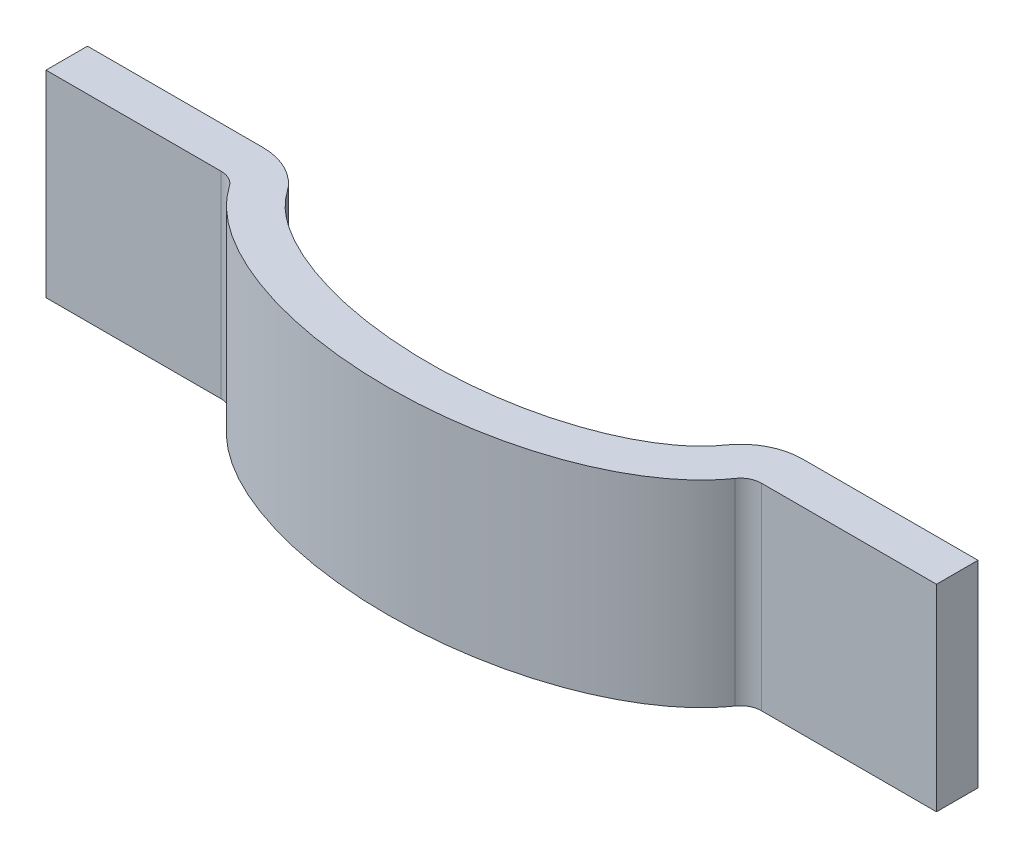
ISO-10303-21;
HEADER;
FILE_DESCRIPTION(('STEP AP214'),'2;1');
FILE_NAME('part.step','',(''),(''),'','','');
FILE_SCHEMA(('AUTOMOTIVE_DESIGN { 1 0 10303 214 1 1 1 1 }'));
ENDSEC;
DATA;
#1=APPLICATION_CONTEXT('core data for automotive mechanical design processes');
#2=APPLICATION_PROTOCOL_DEFINITION('international standard','automotive_design',2000,#1);
#3=PRODUCT_CONTEXT('',#1,'mechanical');
#4=PRODUCT('Part','Part','',(#3));
#5=PRODUCT_RELATED_PRODUCT_CATEGORY('part','',(#4));
#6=PRODUCT_DEFINITION_FORMATION('','',#4);
#7=PRODUCT_DEFINITION_CONTEXT('part definition',#1,'design');
#8=PRODUCT_DEFINITION('design','',#6,#7);
#9=PRODUCT_DEFINITION_SHAPE('','',#8);
#10=(LENGTH_UNIT() NAMED_UNIT(*) SI_UNIT(.MILLI.,.METRE.));
#11=(NAMED_UNIT(*) PLANE_ANGLE_UNIT() SI_UNIT($,.RADIAN.));
#12=(NAMED_UNIT(*) SI_UNIT($,.STERADIAN.) SOLID_ANGLE_UNIT());
#13=UNCERTAINTY_MEASURE_WITH_UNIT(LENGTH_MEASURE(1.E-05),#10,'distance_accuracy_value','');
#14=(GEOMETRIC_REPRESENTATION_CONTEXT(3) GLOBAL_UNCERTAINTY_ASSIGNED_CONTEXT((#13)) GLOBAL_UNIT_ASSIGNED_CONTEXT((#10,
#11,#12)) REPRESENTATION_CONTEXT('',''));
#15=CARTESIAN_POINT('',(0.,0.,0.));
#16=DIRECTION('',(0.,0.,1.));
#17=DIRECTION('',(1.,0.,0.));
#18=AXIS2_PLACEMENT_3D('',#15,#16,#17);
#19=CARTESIAN_POINT('',(85.8323720749977,-5.02962255177763E-09,4.99999999502961));
#20=DIRECTION('',(1.,0.,0.));
#21=DIRECTION('',(0.,1.,0.));
#22=AXIS2_PLACEMENT_3D('',#19,#20,#21);
#23=PLANE('',#22);
#24=DIRECTION('',(0.,0.,-1.));
#25=VECTOR('',#24,1.);
#26=CARTESIAN_POINT('',(85.8323720749977,18.9999999949704,4.99999999502968));
#27=LINE('',#26,#25);
#28=CARTESIAN_POINT('',(85.8323720749977,18.9999999949704,8.99999999502968));
#29=VERTEX_POINT('',#28);
#30=CARTESIAN_POINT('',(85.8323720749977,18.9999999949704,4.99999999502968));
#31=VERTEX_POINT('',#30);
#32=EDGE_CURVE('E11',#29,#31,#27,.T.);
#33=ORIENTED_EDGE('',*,*,#32,.F.);
#34=DIRECTION('',(0.,-1.,0.));
#35=VECTOR('',#34,1.);
#36=CARTESIAN_POINT('',(85.8323720749977,-5.02963642956544E-09,8.99999999502962));
#37=LINE('',#36,#35);
#38=CARTESIAN_POINT('',(85.8323720749977,-5.02963642956544E-09,8.99999999502962));
#39=VERTEX_POINT('',#38);
#40=EDGE_CURVE('E107',#39,#29,#37,.F.);
#41=ORIENTED_EDGE('',*,*,#40,.F.);
#42=DIRECTION('',(0.,0.,-1.));
#43=VECTOR('',#42,1.);
#44=CARTESIAN_POINT('',(85.8323720749977,-5.02962255177763E-09,4.99999999502961));
#45=LINE('',#44,#43);
#46=CARTESIAN_POINT('',(85.8323720749977,-5.02962255177763E-09,4.99999999502961));
#47=VERTEX_POINT('',#46);
#48=EDGE_CURVE('E45',#39,#47,#45,.T.);
#49=ORIENTED_EDGE('',*,*,#48,.T.);
#50=DIRECTION('',(0.,1.,0.));
#51=VECTOR('',#50,1.);
#52=CARTESIAN_POINT('',(85.8323720749977,-5.02962255177763E-09,4.99999999502961));
#53=LINE('',#52,#51);
#54=EDGE_CURVE('E139',#47,#31,#53,.T.);
#55=ORIENTED_EDGE('',*,*,#54,.T.);
#56=EDGE_LOOP('',(#33,#41,#49,#55));
#57=FACE_BOUND('',#56,.T.);
#58=ADVANCED_FACE('F36',(#57),#23,.T.);
#59=CARTESIAN_POINT('',(20.91618604,-5.02962255177763E-09,4.99999999502961));
#60=DIRECTION('',(0.,-1.,0.));
#61=DIRECTION('',(1.,0.,0.));
#62=AXIS2_PLACEMENT_3D('',#59,#60,#61);
#63=PLANE('',#62);
#64=DIRECTION('',(1.,0.,0.));
#65=VECTOR('',#64,1.);
#66=CARTESIAN_POINT('',(20.91618604,-5.02962255177763E-09,4.99999999502961));
#67=LINE('',#66,#65);
#68=CARTESIAN_POINT('',(5.00233882094747E-09,-5.02962255177763E-09,4.99999999502961));
#69=VERTEX_POINT('',#68);
#70=CARTESIAN_POINT('',(16.8897912138371,-5.02962255177763E-09,4.99999999502961));
#71=VERTEX_POINT('',#70);
#72=EDGE_CURVE('E162',#69,#71,#67,.T.);
#73=ORIENTED_EDGE('',*,*,#72,.T.);
#74=CARTESIAN_POINT('',(16.8897912138371,-5.02965030735325E-09,10.9999999950296));
#75=DIRECTION('',(0.,1.,0.));
#76=DIRECTION('',(-1.,0.,0.));
#77=AXIS2_PLACEMENT_3D('',#74,#75,#76);
#78=CIRCLE('',#77,6.);
#79=CARTESIAN_POINT('',(21.832792147523,-5.02963642956544E-09,7.59900870283547));
#80=VERTEX_POINT('',#79);
#81=EDGE_CURVE('E53',#71,#80,#78,.F.);
#82=ORIENTED_EDGE('',*,*,#81,.T.);
#83=CARTESIAN_POINT('',(20.91618604,-5.02962255177763E-09,4.99999999502961));
#84=CARTESIAN_POINT('',(20.91618604,-5.02962255177763E-09,5.43203663686933));
#85=CARTESIAN_POINT('',(21.0612996780334,-5.02962255177763E-09,6.29610992054875));
#86=CARTESIAN_POINT('',(21.9187981969256,-5.02963642956544E-09,7.88664464208802));
#87=CARTESIAN_POINT('',(23.6581810932833,-5.02964336845935E-09,9.6693867916077));
#88=CARTESIAN_POINT('',(27.1749338723224,-5.02965030735325E-09,11.9987857519427));
#89=CARTESIAN_POINT('',(33.5518250020295,-5.02965724624715E-09,14.3281522537659));
#90=CARTESIAN_POINT('',(42.91618604,-5.02966418514106E-09,15.3359238656615));
#91=CARTESIAN_POINT('',(52.2805470779705,-5.02966418514106E-09,14.3281522537659));
#92=CARTESIAN_POINT('',(58.6574382076776,-5.02965030735325E-09,11.9987857519427));
#93=CARTESIAN_POINT('',(62.1741909867167,-5.02963642956544E-09,9.6693867916077));
#94=CARTESIAN_POINT('',(63.9135738830744,-5.02963642956544E-09,7.88664464208802));
#95=CARTESIAN_POINT('',(64.7710724019666,-5.02962255177763E-09,6.29610992054875));
#96=CARTESIAN_POINT('',(64.91618604,-5.02962255177763E-09,5.43203663686933));
#97=CARTESIAN_POINT('',(64.91618604,-5.02962255177763E-09,4.99999999502962));
#98=B_SPLINE_CURVE_WITH_KNOTS('',3,(#83,#84,#85,#86,#87,#88,#89,#90,#91,#92,#93,#94,#95,#96,
#97),.UNSPECIFIED.,.F.,.F.,(4,1,1,1,1,1,1,1,1,1,1,1,4),(3.14159265358979,3.33794219443916,
3.53429173528852,3.73064127613788,3.92699081698724,4.31968989868597,4.71238898038469,
5.10508806208341,5.49778714378214,5.6941366846315,5.89048622548086,6.08683576633022,
6.28318530717959),.UNSPECIFIED.);
#99=CARTESIAN_POINT('',(63.999579932477,-5.02962949067154E-09,7.59900870283545));
#100=VERTEX_POINT('',#99);
#101=EDGE_CURVE('E163',#80,#100,#98,.T.);
#102=ORIENTED_EDGE('',*,*,#101,.T.);
#103=CARTESIAN_POINT('',(68.9425808661629,-5.02965030735325E-09,10.9999999950296));
#104=DIRECTION('',(0.,1.,0.));
#105=DIRECTION('',(-1.,0.,0.));
#106=AXIS2_PLACEMENT_3D('',#103,#104,#105);
#107=CIRCLE('',#106,6.);
#108=CARTESIAN_POINT('',(68.9425808661629,-5.02962255177763E-09,4.99999999502962));
#109=VERTEX_POINT('',#108);
#110=EDGE_CURVE('E160',#100,#109,#107,.F.);
#111=ORIENTED_EDGE('',*,*,#110,.T.);
#112=DIRECTION('',(1.,0.,0.));
#113=VECTOR('',#112,1.);
#114=CARTESIAN_POINT('',(64.91618604,-5.02962255177763E-09,4.99999999502962));
#115=LINE('',#114,#113);
#116=EDGE_CURVE('E151',#109,#47,#115,.T.);
#117=ORIENTED_EDGE('',*,*,#116,.T.);
#118=ORIENTED_EDGE('',*,*,#48,.F.);
#119=DIRECTION('',(-1.,0.,0.));
#120=VECTOR('',#119,1.);
#121=CARTESIAN_POINT('',(64.91618604,-5.02963642956544E-09,8.99999999502962));
#122=LINE('',#121,#120);
#123=CARTESIAN_POINT('',(68.9425808661629,-5.02963642956544E-09,8.99999999502962));
#124=VERTEX_POINT('',#123);
#125=EDGE_CURVE('E231',#124,#39,#122,.F.);
#126=ORIENTED_EDGE('',*,*,#125,.F.);
#127=CARTESIAN_POINT('',(68.9425808661629,-5.02963642956544E-09,10.9999999950296));
#128=DIRECTION('',(0.,1.,0.));
#129=DIRECTION('',(-1.,0.,0.));
#130=AXIS2_PLACEMENT_3D('',#127,#128,#129);
#131=CIRCLE('',#130,2.);
#132=CARTESIAN_POINT('',(67.2949138882676,-5.02963642956544E-09,9.86633623096487));
#133=VERTEX_POINT('',#132);
#134=EDGE_CURVE('E102',#133,#124,#131,.F.);
#135=ORIENTED_EDGE('',*,*,#134,.F.);
#136=CARTESIAN_POINT('',(16.91618604,-5.02962255177763E-09,4.9999999960808));
#137=CARTESIAN_POINT('',(16.9161743724451,-5.0296225515924E-09,5.11153724617075));
#138=CARTESIAN_POINT('',(16.9185602111542,-5.02962255179008E-09,5.22307828175419));
#139=CARTESIAN_POINT('',(16.928298754857,-5.02962256090999E-09,5.44866642514533));
#140=CARTESIAN_POINT('',(16.9357710744222,-5.02962257004471E-09,5.56270836871355));
#141=CARTESIAN_POINT('',(16.9560463661392,-5.02962260611639E-09,5.79241330889182));
#142=CARTESIAN_POINT('',(16.9689439928914,-5.02962263337472E-09,5.90806797741263));
#143=CARTESIAN_POINT('',(17.000240142461,-5.02962271461926E-09,6.14006902716458));
#144=CARTESIAN_POINT('',(17.0187039385489,-5.02962276892791E-09,6.25640659952896));
#145=CARTESIAN_POINT('',(17.061126472899,-5.02962291335307E-09,6.48888394973581));
#146=CARTESIAN_POINT('',(17.0851213695224,-5.02962300370821E-09,6.60501712255569));
#147=CARTESIAN_POINT('',(17.1384375693605,-5.02962322946195E-09,6.83630998664146));
#148=CARTESIAN_POINT('',(17.1677699906899,-5.02962336495507E-09,6.95146711068244));
#149=CARTESIAN_POINT('',(17.2314709800462,-5.02962368993565E-09,7.18020283934239));
#150=CARTESIAN_POINT('',(17.2658324144118,-5.02962387934698E-09,7.29378343445131));
#151=CARTESIAN_POINT('',(17.3392293301739,-5.02962432240963E-09,7.51896208829325));
#152=CARTESIAN_POINT('',(17.3782472977682,-5.02962457582401E-09,7.63056586911124));
#153=CARTESIAN_POINT('',(17.4609836383614,-5.02962515522128E-09,7.85270132954783));
#154=CARTESIAN_POINT('',(17.5047262645825,-5.0296254815888E-09,7.96322396077123));
#155=CARTESIAN_POINT('',(17.597238645979,-5.029626191349E-09,8.18415346136891));
#156=CARTESIAN_POINT('',(17.6460756394417,-5.02962657554496E-09,8.29453214999154));
#157=CARTESIAN_POINT('',(17.7487812395185,-5.02962738862746E-09,8.51502265062714));
#158=CARTESIAN_POINT('',(17.8027165108012,-5.0296278181182E-09,8.62510337782627));
#159=CARTESIAN_POINT('',(17.915617278953,-5.0296287081758E-09,8.84486090082475));
#160=CARTESIAN_POINT('',(17.9746489180535,-5.02962916912711E-09,8.95450368302538));
#161=CARTESIAN_POINT('',(18.097738152213,-5.02963010885435E-09,9.17326324725521));
#162=CARTESIAN_POINT('',(18.1618614541489,-5.02963058779786E-09,9.28234302244829));
#163=CARTESIAN_POINT('',(18.2951292260116,-5.02963155011856E-09,9.49987062355497));
#164=CARTESIAN_POINT('',(18.3643390590812,-5.02963203343861E-09,9.60827836691791));
#165=CARTESIAN_POINT('',(18.50777693091,-5.02963299133332E-09,9.824372333502));
#166=CARTESIAN_POINT('',(18.5820700693053,-5.02963346562159E-09,9.93201530403146));
#167=CARTESIAN_POINT('',(18.7356762337312,-5.02963439158777E-09,10.1465060042833));
#168=CARTESIAN_POINT('',(18.8150541640672,-5.02963484272785E-09,10.2533072111181));
#169=CARTESIAN_POINT('',(18.9785501612371,-5.02963570966029E-09,10.4656850463085));
#170=CARTESIAN_POINT('',(19.0627201672196,-5.02963612484731E-09,10.5712216465506));
#171=CARTESIAN_POINT('',(19.2355050078153,-5.02963692332399E-09,10.780809970614));
#172=CARTESIAN_POINT('',(19.3241622062681,-5.02963730615087E-09,10.8848267224874));
#173=CARTESIAN_POINT('',(19.5059409857008,-5.02963804278601E-09,11.091507760016));
#174=CARTESIAN_POINT('',(19.599107991576,-5.02963839610691E-09,11.1941320706863));
#175=CARTESIAN_POINT('',(19.7899301414174,-5.0296390772396E-09,11.3981096750127));
#176=CARTESIAN_POINT('',(19.887632414787,-5.02963940457234E-09,11.4994187605147));
#177=CARTESIAN_POINT('',(20.1900694882335,-5.02964036157935E-09,11.8040882330675));
#178=CARTESIAN_POINT('',(20.3994400981796,-5.02964094770401E-09,12.0028735931563));
#179=CARTESIAN_POINT('',(20.836299154495,-5.02964205931747E-09,12.3957557690563));
#180=CARTESIAN_POINT('',(21.0641683852207,-5.02964258186759E-09,12.589426877698));
#181=CARTESIAN_POINT('',(21.5371913769116,-5.02964359309785E-09,12.9709012601244));
#182=CARTESIAN_POINT('',(21.7826667819693,-5.02964408010887E-09,13.1583047973043));
#183=CARTESIAN_POINT('',(22.2897458712118,-5.02964502521076E-09,13.5265168970029));
#184=CARTESIAN_POINT('',(22.551612185966,-5.02964548200734E-09,13.7069625094543));
#185=CARTESIAN_POINT('',(23.0914272373885,-5.02964637144191E-09,14.0612507207614));
#186=CARTESIAN_POINT('',(23.3696228831782,-5.02964680289486E-09,14.2347161861775));
#187=CARTESIAN_POINT('',(23.9419913433656,-5.02964764662451E-09,14.5747476868714));
#188=CARTESIAN_POINT('',(24.2363918445826,-5.0296480578831E-09,14.7409296777835));
#189=CARTESIAN_POINT('',(24.839807059353,-5.02964886680325E-09,15.0652540109701));
#190=CARTESIAN_POINT('',(25.1490019020899,-5.02964926380257E-09,15.2230603667679));
#191=CARTESIAN_POINT('',(25.7803714316949,-5.02965004515266E-09,15.5301159231603));
#192=CARTESIAN_POINT('',(26.1026812162057,-5.02965042900569E-09,15.6790864642292));
#193=CARTESIAN_POINT('',(26.7598292417859,-5.02965118441102E-09,15.968534305583));
#194=CARTESIAN_POINT('',(27.0947858265646,-5.02965155548674E-09,16.1087422697028));
#195=CARTESIAN_POINT('',(27.7767205329419,-5.02965228635891E-09,16.3805730114974));
#196=CARTESIAN_POINT('',(28.1238009324832,-5.02965264572684E-09,16.5119386381928));
#197=CARTESIAN_POINT('',(28.8294290170005,-5.0296533540072E-09,16.7658746860609));
#198=CARTESIAN_POINT('',(29.1880642256742,-5.02965370253973E-09,16.8882014394368));
#199=CARTESIAN_POINT('',(29.9162055480195,-5.02965439000484E-09,17.1237596975985));
#200=CARTESIAN_POINT('',(30.2857858813741,-5.02965472860773E-09,17.2367614032883));
#201=CARTESIAN_POINT('',(31.035185610405,-5.02965539711984E-09,17.4532996925391));
#202=CARTESIAN_POINT('',(31.4150673540528,-5.02965572674876E-09,17.5566202075538));
#203=CARTESIAN_POINT('',(32.1844084087919,-5.02965637797156E-09,17.7533690919678));
#204=CARTESIAN_POINT('',(32.5739195204408,-5.02965669932672E-09,17.8465946662375));
#205=CARTESIAN_POINT('',(33.361059037219,-5.02965733500874E-09,18.0225123701364));
#206=CARTESIAN_POINT('',(33.7587246037666,-5.02965764917344E-09,18.1050381201058));
#207=CARTESIAN_POINT('',(34.5605834732077,-5.02965826695579E-09,18.2593762132713));
#208=CARTESIAN_POINT('',(34.9648008106285,-5.02965857042221E-09,18.331062736629));
#209=CARTESIAN_POINT('',(36.191300773287,-5.02965946314877E-09,18.5309431008681));
#210=CARTESIAN_POINT('',(37.0165076732766,-5.02966002577134E-09,18.6415405049109));
#211=CARTESIAN_POINT('',(38.6828526274505,-5.02966106572686E-09,18.8198639311707));
#212=CARTESIAN_POINT('',(39.5240543216807,-5.02966154178979E-09,18.8869836964897));
#213=CARTESIAN_POINT('',(41.2155533173756,-5.02966237935971E-09,18.9772291673762));
#214=CARTESIAN_POINT('',(42.0658696786878,-5.0296627399235E-09,18.9999999950296));
#215=CARTESIAN_POINT('',(43.7665024013122,-5.02966331739398E-09,18.9999999950296));
#216=CARTESIAN_POINT('',(44.6168187626244,-5.02966353430067E-09,18.9772291673762));
#217=CARTESIAN_POINT('',(46.3083177582773,-5.02966377251784E-09,18.886983696492));
#218=CARTESIAN_POINT('',(47.1495194524657,-5.02966379536128E-09,18.8198639311774));
#219=CARTESIAN_POINT('',(48.8158644066078,-5.0296635932817E-09,18.6415405049255));
#220=CARTESIAN_POINT('',(49.6410713066071,-5.02966337169342E-09,18.5309431008835));
#221=CARTESIAN_POINT('',(50.8675712693457,-5.02966281087331E-09,18.3310627366341));
#222=CARTESIAN_POINT('',(51.2717886068367,-5.02966258814745E-09,18.2593762132639));
#223=CARTESIAN_POINT('',(52.0736474764037,-5.02966206164176E-09,18.1050381200718));
#224=CARTESIAN_POINT('',(52.4713130430073,-5.02966175875667E-09,18.0225123700888));
#225=CARTESIAN_POINT('',(53.2584525599509,-5.02966106524777E-09,17.846594666147));
#226=CARTESIAN_POINT('',(53.6479636717087,-5.02966067589762E-09,17.7533690918465));
#227=CARTESIAN_POINT('',(54.4173047262424,-5.02965981601802E-09,17.5566202074717));
#228=CARTESIAN_POINT('',(54.7971864695791,-5.02965934698669E-09,17.45329969254));
#229=CARTESIAN_POINT('',(55.5465861983779,-5.02965833519052E-09,17.2367614033636));
#230=CARTESIAN_POINT('',(55.9161665318079,-5.02965779393439E-09,17.1237596976531));
#231=CARTESIAN_POINT('',(56.6443078543346,-5.02965664484316E-09,16.888201439435));
#232=CARTESIAN_POINT('',(57.002943063114,-5.02965603851537E-09,16.7658746860225));
#233=CARTESIAN_POINT('',(57.708571147528,-5.02965476649799E-09,16.5119386381861));
#234=CARTESIAN_POINT('',(58.0556515468641,-5.02965410229172E-09,16.3805730115693));
#235=CARTESIAN_POINT('',(58.7375862531275,-5.02965272186176E-09,16.1087422698308));
#236=CARTESIAN_POINT('',(59.0725428379933,-5.02965200706778E-09,15.9685343056783));
#237=CARTESIAN_POINT('',(59.729690863705,-5.02965053237392E-09,15.6790864642705));
#238=CARTESIAN_POINT('',(60.0520006482608,-5.0296497738263E-09,15.5301159231819));
#239=CARTESIAN_POINT('',(60.6833701779179,-5.02964822023948E-09,15.2230603667641));
#240=CARTESIAN_POINT('',(60.9925650206625,-5.02964742639718E-09,15.0652540109622));
#241=CARTESIAN_POINT('',(61.5959802354945,-5.02964580827279E-09,14.7409296777416));
#242=CARTESIAN_POINT('',(61.8903807367645,-5.02964498533068E-09,14.5747476867978));
#243=CARTESIAN_POINT('',(62.4627491972143,-5.02964337017131E-09,14.2347161859408));
#244=CARTESIAN_POINT('',(62.7409448432095,-5.0296425777777E-09,14.0612507203866));
#245=CARTESIAN_POINT('',(63.2807598945055,-5.0296410882468E-09,13.7069625091277));
#246=CARTESIAN_POINT('',(63.5426262089435,-5.02964038896418E-09,13.5265168968863));
#247=CARTESIAN_POINT('',(64.0497052977996,-5.02963914898641E-09,13.1583047974758));
#248=CARTESIAN_POINT('',(64.295180702779,-5.02963860428768E-09,12.9709012603627));
#249=CARTESIAN_POINT('',(64.7682036947078,-5.02963773823961E-09,12.5894268777665));
#250=CARTESIAN_POINT('',(64.9960729257335,-5.0296374103568E-09,12.3957557688682));
#251=CARTESIAN_POINT('',(65.4329319818631,-5.02963685006377E-09,12.0028735931011));
#252=CARTESIAN_POINT('',(65.6423025913607,-5.02963661473439E-09,11.8040882334433));
#253=CARTESIAN_POINT('',(65.9447396644219,-5.02963623172008E-09,11.4994187613277));
#254=CARTESIAN_POINT('',(66.0424419378267,-5.02963610089305E-09,11.3981096758051));
#255=CARTESIAN_POINT('',(66.2332640873433,-5.02963581402115E-09,11.1941320718569));
#256=CARTESIAN_POINT('',(66.326431092871,-5.02963565839072E-09,11.0915077615974));
#257=CARTESIAN_POINT('',(66.5082098723689,-5.02963530586341E-09,10.8848267240789));
#258=CARTESIAN_POINT('',(66.5968670712084,-5.02963510957272E-09,10.7808099717819));
#259=CARTESIAN_POINT('',(66.7696519119969,-5.02963466011065E-09,10.5712216475171));
#260=CARTESIAN_POINT('',(66.8538219178075,-5.02963440767029E-09,10.4656850475151));
#261=CARTESIAN_POINT('',(67.0173179150028,-5.02963382967951E-09,10.25330721236));
#262=CARTESIAN_POINT('',(67.0966958455204,-5.0296335052223E-09,10.1465060053084));
#263=CARTESIAN_POINT('',(67.2503020105454,-5.02963280057033E-09,9.93201530425956));
#264=CARTESIAN_POINT('',(67.3245951493462,-5.02963242142509E-09,9.82437233314135));
#265=CARTESIAN_POINT('',(67.4680330217094,-5.02963162620009E-09,9.60827836570196));
#266=CARTESIAN_POINT('',(67.5372428549209,-5.02963121083992E-09,9.49987062208099));
#267=CARTESIAN_POINT('',(67.6705106266378,-5.02963036146425E-09,9.28234302111676));
#268=CARTESIAN_POINT('',(67.7346339283105,-5.0296299278607E-09,9.17326324633919));
#269=CARTESIAN_POINT('',(67.8577231618121,-5.02962906042187E-09,8.95450368324996));
#270=CARTESIAN_POINT('',(67.9167548005284,-5.02962862669952E-09,8.84486090178035));
#271=CARTESIAN_POINT('',(68.029655569002,-5.02962777730225E-09,8.62510337826225));
#272=CARTESIAN_POINT('',(68.0835908409139,-5.02962736145139E-09,8.51502264977299));
#273=CARTESIAN_POINT('',(68.1862964409713,-5.02962656644095E-09,8.29453214903176));
#274=CARTESIAN_POINT('',(68.2351334338839,-5.02962618681551E-09,8.18415346163948));
#275=CARTESIAN_POINT('',(68.3276458147993,-5.02962548157015E-09,7.9632239623036));
#276=CARTESIAN_POINT('',(68.3713884410398,-5.0296251552163E-09,7.85270133109088));
#277=CARTESIAN_POINT('',(68.4541247816553,-5.02962457582896E-09,7.63056587072326));
#278=CARTESIAN_POINT('',(68.4931427492544,-5.02962432241095E-09,7.51896208996428));
#279=CARTESIAN_POINT('',(68.5665396655275,-5.02962387934564E-09,7.29378343472071));
#280=CARTESIAN_POINT('',(68.6009011003345,-5.02962368993529E-09,7.18020283812997));
#281=CARTESIAN_POINT('',(68.6646020895976,-5.02962336495543E-09,6.95146710949485));
#282=CARTESIAN_POINT('',(68.6939345105266,-5.02962322946204E-09,6.83630998699792));
#283=CARTESIAN_POINT('',(68.7472507099193,-5.02962300370811E-09,6.60501712511078));
#284=CARTESIAN_POINT('',(68.7712456064556,-5.02962291335304E-09,6.48888395293573));
#285=CARTESIAN_POINT('',(68.8136681412832,-5.02962276892793E-09,6.25640660078371));
#286=CARTESIAN_POINT('',(68.8321319377858,-5.02962271461927E-09,6.14006902580194));
#287=CARTESIAN_POINT('',(68.8634280873134,-5.02962263337471E-09,5.90806797543295));
#288=CARTESIAN_POINT('',(68.8763257138242,-5.02962260611639E-09,5.79241330894153));
#289=CARTESIAN_POINT('',(68.8966010054243,-5.02962257004471E-09,5.56270837081048));
#290=CARTESIAN_POINT('',(68.9040733250205,-5.02962256090999E-09,5.44866642725193));
#291=CARTESIAN_POINT('',(68.9138118688914,-5.02962255179007E-09,5.22307828141551));
#292=CARTESIAN_POINT('',(68.9161977076303,-5.0296225515924E-09,5.11153724337253));
#293=CARTESIAN_POINT('',(68.91618604,-5.02962255177763E-09,4.99999999082489));
#294=B_SPLINE_CURVE_WITH_KNOTS('',3,(#136,#137,#138,#139,#140,#141,#142,#143,#144,#145,#146,
#147,#148,#149,#150,#151,#152,#153,#154,#155,#156,#157,#158,#159,#160,#161,#162,#163,#164,#165,
#166,#167,#168,#169,#170,#171,#172,#173,#174,#175,#176,#177,#178,#179,#180,#181,#182,#183,#184,
#185,#186,#187,#188,#189,#190,#191,#192,#193,#194,#195,#196,#197,#198,#199,#200,#201,#202,#203,
#204,#205,#206,#207,#208,#209,#210,#211,#212,#213,#214,#215,#216,#217,#218,#219,#220,#221,#222,
#223,#224,#225,#226,#227,#228,#229,#230,#231,#232,#233,#234,#235,#236,#237,#238,#239,#240,#241,
#242,#243,#244,#245,#246,#247,#248,#249,#250,#251,#252,#253,#254,#255,#256,#257,#258,#259,#260,
#261,#262,#263,#264,#265,#266,#267,#268,#269,#270,#271,#272,#273,#274,#275,#276,#277,#278,#279,
#280,#281,#282,#283,#284,#285,#286,#287,#288,#289,#290,#291,#292,#293),.UNSPECIFIED.,.F.,.F.,(4,
2,2,2,2,2,2,2,2,2,2,2,2,2,2,2,2,2,2,2,2,2,2,2,2,2,2,2,2,2,2,2,2,2,2,2,2,2,2,2,2,2,2,2,2,2,2,2,2,
2,2,2,2,2,2,2,2,2,2,2,2,2,2,2,2,2,2,2,2,2,2,2,2,2,2,2,2,2,4),(0.,0.33459178239236,
0.67733680652383,1.02632736893503,1.37958113581644,1.73521322161567,2.09159475354016,
2.4474755713402,2.80205773123569,3.15855536375692,3.52056191472086,3.88822159718954,
4.26170457953789,4.64121146864462,5.02697649128564,5.41926944086841,5.81839655171343,
6.22329406644944,6.63324502874466,7.04899785570909,7.47118101160568,8.33679231604937,
9.23353344104292,10.159635135032,11.1133345544598,12.0965467242637,13.1104308932334,
14.1515568294948,15.2165209509438,16.3056441593594,17.4187587945138,18.5553293737951,
19.7145470866631,20.895404500154,22.0967554499843,23.3149837184267,24.5464165358916,
27.0427967696885,29.573277385224,32.1239249064592,34.6745724276944,37.205053043104,
39.7014332769296,40.9328660946079,42.151094363223,43.3524453133926,44.5333027259181,
45.6925204390206,46.8290910186372,47.9422056531328,49.0313288618272,50.0962929834237,
51.1374189197112,52.151303088866,53.134515259411,54.0882146777015,55.0143163713829,
55.9110574975586,56.7766688001398,57.1988519561542,57.6146047815065,58.0245557455202,
58.4294532593721,58.8285803710638,59.2208733227896,59.6066383463116,59.9861452339445,
60.3596282138177,60.7272879005885,61.089294447513,61.4457920800256,61.8003742397594,
62.1562550621926,62.5126365893371,62.8682686731917,63.2215224480131,63.5705130043013,
63.9132580284097,64.2478498181736),.UNSPECIFIED.);
#295=CARTESIAN_POINT('',(18.5374581917324,-5.02963642956544E-09,9.86633623096489));
#296=VERTEX_POINT('',#295);
#297=EDGE_CURVE('E226',#296,#133,#294,.T.);
#298=ORIENTED_EDGE('',*,*,#297,.F.);
#299=CARTESIAN_POINT('',(16.8897912138371,-5.02965030735325E-09,10.9999999950296));
#300=DIRECTION('',(0.,1.,0.));
#301=DIRECTION('',(-1.,0.,0.));
#302=AXIS2_PLACEMENT_3D('',#299,#300,#301);
#303=CIRCLE('',#302,2.);
#304=CARTESIAN_POINT('',(16.8897912138371,-5.02963642956544E-09,8.9999999950296));
#305=VERTEX_POINT('',#304);
#306=EDGE_CURVE('E232',#305,#296,#303,.F.);
#307=ORIENTED_EDGE('',*,*,#306,.F.);
#308=DIRECTION('',(-1.,0.,0.));
#309=VECTOR('',#308,1.);
#310=CARTESIAN_POINT('',(20.91618604,-5.02963642956544E-09,8.99999999502961));
#311=LINE('',#310,#309);
#312=CARTESIAN_POINT('',(5.00233882094747E-09,-5.02963642956544E-09,8.99999999502961));
#313=VERTEX_POINT('',#312);
#314=EDGE_CURVE('E240',#313,#305,#311,.F.);
#315=ORIENTED_EDGE('',*,*,#314,.F.);
#316=DIRECTION('',(0.,0.,-1.));
#317=VECTOR('',#316,1.);
#318=CARTESIAN_POINT('',(5.00233882094747E-09,-5.02962255177763E-09,4.99999999502961));
#319=LINE('',#318,#317);
#320=EDGE_CURVE('E131',#313,#69,#319,.T.);
#321=ORIENTED_EDGE('',*,*,#320,.T.);
#322=EDGE_LOOP('',(#73,#82,#102,#111,#117,#118,#126,#135,#298,#307,#315,#321));
#323=FACE_BOUND('',#322,.T.);
#324=ADVANCED_FACE('F158',(#323),#63,.T.);
#325=CARTESIAN_POINT('',(5.00233882094747E-09,-5.02962255177763E-09,4.99999999502961));
#326=DIRECTION('',(1.,0.,0.));
#327=DIRECTION('',(0.,1.,0.));
#328=AXIS2_PLACEMENT_3D('',#325,#326,#327);
#329=PLANE('',#328);
#330=ORIENTED_EDGE('',*,*,#320,.F.);
#331=DIRECTION('',(0.,-1.,0.));
#332=VECTOR('',#331,1.);
#333=CARTESIAN_POINT('',(5.00233882094747E-09,-5.02963642956544E-09,8.99999999502961));
#334=LINE('',#333,#332);
#335=CARTESIAN_POINT('',(5.00233882094747E-09,18.9999999949704,8.99999999502968));
#336=VERTEX_POINT('',#335);
#337=EDGE_CURVE('E241',#313,#336,#334,.F.);
#338=ORIENTED_EDGE('',*,*,#337,.T.);
#339=DIRECTION('',(0.,0.,-1.));
#340=VECTOR('',#339,1.);
#341=CARTESIAN_POINT('',(5.00233882094747E-09,18.9999999949704,4.99999999502968));
#342=LINE('',#341,#340);
#343=CARTESIAN_POINT('',(5.00233882094747E-09,18.9999999949704,4.99999999502968));
#344=VERTEX_POINT('',#343);
#345=EDGE_CURVE('E128',#336,#344,#342,.T.);
#346=ORIENTED_EDGE('',*,*,#345,.T.);
#347=DIRECTION('',(0.,1.,0.));
#348=VECTOR('',#347,1.);
#349=CARTESIAN_POINT('',(5.00233882094747E-09,-5.02962255177763E-09,4.99999999502961));
#350=LINE('',#349,#348);
#351=EDGE_CURVE('E156',#69,#344,#350,.T.);
#352=ORIENTED_EDGE('',*,*,#351,.F.);
#353=EDGE_LOOP('',(#330,#338,#346,#352));
#354=FACE_BOUND('',#353,.T.);
#355=ADVANCED_FACE('F266',(#354),#329,.F.);
#356=CARTESIAN_POINT('',(68.9425808661629,18.9999999949704,10.9999999950296));
#357=DIRECTION('',(0.,-1.,0.));
#358=DIRECTION('',(1.,0.,0.));
#359=AXIS2_PLACEMENT_3D('',#356,#357,#358);
#360=PLANE('',#359);
#361=CARTESIAN_POINT('',(68.9425808661629,18.9999999949704,10.9999999950296));
#362=DIRECTION('',(0.,1.,0.));
#363=DIRECTION('',(-1.,0.,0.));
#364=AXIS2_PLACEMENT_3D('',#361,#362,#363);
#365=CIRCLE('',#364,2.);
#366=CARTESIAN_POINT('',(68.9425808661629,18.9999999949704,8.99999999502964));
#367=VERTEX_POINT('',#366);
#368=CARTESIAN_POINT('',(67.2949138882676,18.9999999949704,9.86633623096493));
#369=VERTEX_POINT('',#368);
#370=EDGE_CURVE('E99',#367,#369,#365,.T.);
#371=ORIENTED_EDGE('',*,*,#370,.F.);
#372=DIRECTION('',(-1.,0.,0.));
#373=VECTOR('',#372,1.);
#374=CARTESIAN_POINT('',(64.91618604,18.9999999949704,8.99999999502968));
#375=LINE('',#374,#373);
#376=EDGE_CURVE('E111',#367,#29,#375,.F.);
#377=ORIENTED_EDGE('',*,*,#376,.T.);
#378=ORIENTED_EDGE('',*,*,#32,.T.);
#379=DIRECTION('',(1.,0.,0.));
#380=VECTOR('',#379,1.);
#381=CARTESIAN_POINT('',(64.91618604,18.9999999949704,4.99999999502968));
#382=LINE('',#381,#380);
#383=CARTESIAN_POINT('',(68.9425808661629,18.9999999949704,4.99999999502968));
#384=VERTEX_POINT('',#383);
#385=EDGE_CURVE('E154',#384,#31,#382,.T.);
#386=ORIENTED_EDGE('',*,*,#385,.F.);
#387=CARTESIAN_POINT('',(68.9425808661629,18.9999999949704,10.9999999950296));
#388=DIRECTION('',(0.,1.,0.));
#389=DIRECTION('',(-1.,0.,0.));
#390=AXIS2_PLACEMENT_3D('',#387,#388,#389);
#391=CIRCLE('',#390,6.);
#392=CARTESIAN_POINT('',(63.999579932477,18.9999999949704,7.59900870283552));
#393=VERTEX_POINT('',#392);
#394=EDGE_CURVE('E187',#384,#393,#391,.T.);
#395=ORIENTED_EDGE('',*,*,#394,.T.);
#396=CARTESIAN_POINT('',(20.91618604,18.9999999949704,4.99999999502968));
#397=CARTESIAN_POINT('',(20.91618604,18.9999999949704,5.43203663686939));
#398=CARTESIAN_POINT('',(21.0612996780334,18.9999999949704,6.29610992054882));
#399=CARTESIAN_POINT('',(21.9187981969256,18.9999999949704,7.88664464208809));
#400=CARTESIAN_POINT('',(23.6581810932833,18.9999999949704,9.66938679160776));
#401=CARTESIAN_POINT('',(27.1749338723224,18.9999999949704,11.9987857519428));
#402=CARTESIAN_POINT('',(33.5518250020295,18.9999999949703,14.328152253766));
#403=CARTESIAN_POINT('',(42.91618604,18.9999999949703,15.3359238656615));
#404=CARTESIAN_POINT('',(52.2805470779705,18.9999999949703,14.328152253766));
#405=CARTESIAN_POINT('',(58.6574382076776,18.9999999949704,11.9987857519428));
#406=CARTESIAN_POINT('',(62.1741909867167,18.9999999949704,9.66938679160776));
#407=CARTESIAN_POINT('',(63.9135738830744,18.9999999949704,7.88664464208809));
#408=CARTESIAN_POINT('',(64.7710724019666,18.9999999949704,6.29610992054882));
#409=CARTESIAN_POINT('',(64.91618604,18.9999999949704,5.4320366368694));
#410=CARTESIAN_POINT('',(64.91618604,18.9999999949704,4.99999999502968));
#411=B_SPLINE_CURVE_WITH_KNOTS('',3,(#396,#397,#398,#399,#400,#401,#402,#403,#404,#405,#406,
#407,#408,#409,#410),.UNSPECIFIED.,.F.,.F.,(4,1,1,1,1,1,1,1,1,1,1,1,4),(3.14159265358979,
3.33794219443916,3.53429173528852,3.73064127613788,3.92699081698724,4.31968989868597,
4.71238898038469,5.10508806208341,5.49778714378214,5.6941366846315,5.89048622548086,
6.08683576633022,6.28318530717959),.UNSPECIFIED.);
#412=CARTESIAN_POINT('',(21.832792147523,18.9999999949704,7.59900870283553));
#413=VERTEX_POINT('',#412);
#414=EDGE_CURVE('E169',#413,#393,#411,.T.);
#415=ORIENTED_EDGE('',*,*,#414,.F.);
#416=CARTESIAN_POINT('',(16.8897912138371,18.9999999949704,10.9999999950297));
#417=DIRECTION('',(0.,1.,0.));
#418=DIRECTION('',(-1.,0.,0.));
#419=AXIS2_PLACEMENT_3D('',#416,#417,#418);
#420=CIRCLE('',#419,6.);
#421=CARTESIAN_POINT('',(16.8897912138371,18.9999999949704,4.99999999502968));
#422=VERTEX_POINT('',#421);
#423=EDGE_CURVE('E184',#413,#422,#420,.T.);
#424=ORIENTED_EDGE('',*,*,#423,.T.);
#425=DIRECTION('',(1.,0.,0.));
#426=VECTOR('',#425,1.);
#427=CARTESIAN_POINT('',(20.91618604,18.9999999949704,4.99999999502968));
#428=LINE('',#427,#426);
#429=EDGE_CURVE('E166',#344,#422,#428,.T.);
#430=ORIENTED_EDGE('',*,*,#429,.F.);
#431=ORIENTED_EDGE('',*,*,#345,.F.);
#432=DIRECTION('',(-1.,0.,0.));
#433=VECTOR('',#432,1.);
#434=CARTESIAN_POINT('',(20.91618604,18.9999999949704,8.99999999502968));
#435=LINE('',#434,#433);
#436=CARTESIAN_POINT('',(16.8897912138371,18.9999999949704,8.99999999502968));
#437=VERTEX_POINT('',#436);
#438=EDGE_CURVE('E115',#336,#437,#435,.F.);
#439=ORIENTED_EDGE('',*,*,#438,.T.);
#440=CARTESIAN_POINT('',(16.8897912138371,18.9999999949704,10.9999999950297));
#441=DIRECTION('',(0.,1.,0.));
#442=DIRECTION('',(-1.,0.,0.));
#443=AXIS2_PLACEMENT_3D('',#440,#441,#442);
#444=CIRCLE('',#443,2.);
#445=CARTESIAN_POINT('',(18.5374581917324,18.9999999949704,9.86633623096495));
#446=VERTEX_POINT('',#445);
#447=EDGE_CURVE('E106',#446,#437,#444,.T.);
#448=ORIENTED_EDGE('',*,*,#447,.F.);
#449=CARTESIAN_POINT('',(16.91618604,18.9999999949704,4.99999999608086));
#450=CARTESIAN_POINT('',(16.9161743724451,18.9999999949704,5.11153724617082));
#451=CARTESIAN_POINT('',(16.9185602111542,18.9999999949704,5.22307828175426));
#452=CARTESIAN_POINT('',(16.928298754857,18.9999999949704,5.44866642514539));
#453=CARTESIAN_POINT('',(16.9357710744222,18.9999999949704,5.56270836871362));
#454=CARTESIAN_POINT('',(16.9560463661392,18.9999999949704,5.79241330889189));
#455=CARTESIAN_POINT('',(16.9689439928914,18.9999999949704,5.90806797741269));
#456=CARTESIAN_POINT('',(17.000240142461,18.9999999949704,6.14006902716465));
#457=CARTESIAN_POINT('',(17.0187039385489,18.9999999949704,6.25640659952903));
#458=CARTESIAN_POINT('',(17.061126472899,18.9999999949704,6.48888394973587));
#459=CARTESIAN_POINT('',(17.0851213695224,18.9999999949704,6.60501712255576));
#460=CARTESIAN_POINT('',(17.1384375693605,18.9999999949704,6.83630998664153));
#461=CARTESIAN_POINT('',(17.1677699906899,18.9999999949704,6.95146711068251));
#462=CARTESIAN_POINT('',(17.2314709800462,18.9999999949704,7.18020283934246));
#463=CARTESIAN_POINT('',(17.2658324144118,18.9999999949704,7.29378343445137));
#464=CARTESIAN_POINT('',(17.3392293301739,18.9999999949704,7.51896208829331));
#465=CARTESIAN_POINT('',(17.3782472977682,18.9999999949704,7.63056586911131));
#466=CARTESIAN_POINT('',(17.4609836383614,18.9999999949704,7.8527013295479));
#467=CARTESIAN_POINT('',(17.5047262645825,18.9999999949704,7.96322396077129));
#468=CARTESIAN_POINT('',(17.597238645979,18.9999999949704,8.18415346136898));
#469=CARTESIAN_POINT('',(17.6460756394417,18.9999999949704,8.29453214999161));
#470=CARTESIAN_POINT('',(17.7487812395185,18.9999999949704,8.5150226506272));
#471=CARTESIAN_POINT('',(17.8027165108012,18.9999999949704,8.62510337782633));
#472=CARTESIAN_POINT('',(17.915617278953,18.9999999949704,8.84486090082482));
#473=CARTESIAN_POINT('',(17.9746489180535,18.9999999949704,8.95450368302545));
#474=CARTESIAN_POINT('',(18.097738152213,18.9999999949704,9.17326324725527));
#475=CARTESIAN_POINT('',(18.1618614541489,18.9999999949704,9.28234302244836));
#476=CARTESIAN_POINT('',(18.2951292260116,18.9999999949704,9.49987062355503));
#477=CARTESIAN_POINT('',(18.3643390590812,18.9999999949704,9.60827836691798));
#478=CARTESIAN_POINT('',(18.50777693091,18.9999999949704,9.82437233350206));
#479=CARTESIAN_POINT('',(18.5820700693053,18.9999999949704,9.93201530403153));
#480=CARTESIAN_POINT('',(18.7356762337312,18.9999999949704,10.1465060042834));
#481=CARTESIAN_POINT('',(18.8150541640672,18.9999999949704,10.2533072111182));
#482=CARTESIAN_POINT('',(18.9785501612371,18.9999999949704,10.4656850463086));
#483=CARTESIAN_POINT('',(19.0627201672196,18.9999999949704,10.5712216465507));
#484=CARTESIAN_POINT('',(19.2355050078153,18.9999999949704,10.780809970614));
#485=CARTESIAN_POINT('',(19.3241622062681,18.9999999949704,10.8848267224874));
#486=CARTESIAN_POINT('',(19.5059409857008,18.9999999949704,11.0915077600161));
#487=CARTESIAN_POINT('',(19.599107991576,18.9999999949704,11.1941320706863));
#488=CARTESIAN_POINT('',(19.7899301414174,18.9999999949704,11.3981096750128));
#489=CARTESIAN_POINT('',(19.887632414787,18.9999999949704,11.4994187605148));
#490=CARTESIAN_POINT('',(20.1900694882335,18.9999999949704,11.8040882330675));
#491=CARTESIAN_POINT('',(20.3994400981796,18.9999999949704,12.0028735931563));
#492=CARTESIAN_POINT('',(20.836299154495,18.9999999949704,12.3957557690563));
#493=CARTESIAN_POINT('',(21.0641683852207,18.9999999949704,12.589426877698));
#494=CARTESIAN_POINT('',(21.5371913769116,18.9999999949704,12.9709012601245));
#495=CARTESIAN_POINT('',(21.7826667819693,18.9999999949704,13.1583047973044));
#496=CARTESIAN_POINT('',(22.2897458712118,18.9999999949704,13.5265168970029));
#497=CARTESIAN_POINT('',(22.551612185966,18.9999999949704,13.7069625094544));
#498=CARTESIAN_POINT('',(23.0914272373885,18.9999999949704,14.0612507207614));
#499=CARTESIAN_POINT('',(23.3696228831782,18.9999999949704,14.2347161861776));
#500=CARTESIAN_POINT('',(23.9419913433656,18.9999999949704,14.5747476868715));
#501=CARTESIAN_POINT('',(24.2363918445826,18.9999999949704,14.7409296777836));
#502=CARTESIAN_POINT('',(24.839807059353,18.9999999949704,15.0652540109702));
#503=CARTESIAN_POINT('',(25.1490019020899,18.9999999949703,15.223060366768));
#504=CARTESIAN_POINT('',(25.7803714316949,18.9999999949703,15.5301159231604));
#505=CARTESIAN_POINT('',(26.1026812162057,18.9999999949703,15.6790864642293));
#506=CARTESIAN_POINT('',(26.7598292417859,18.9999999949703,15.9685343055831));
#507=CARTESIAN_POINT('',(27.0947858265646,18.9999999949703,16.1087422697029));
#508=CARTESIAN_POINT('',(27.7767205329419,18.9999999949703,16.3805730114975));
#509=CARTESIAN_POINT('',(28.1238009324832,18.9999999949703,16.5119386381929));
#510=CARTESIAN_POINT('',(28.8294290170005,18.9999999949703,16.765874686061));
#511=CARTESIAN_POINT('',(29.1880642256742,18.9999999949703,16.8882014394368));
#512=CARTESIAN_POINT('',(29.9162055480195,18.9999999949703,17.1237596975985));
#513=CARTESIAN_POINT('',(30.2857858813741,18.9999999949703,17.2367614032883));
#514=CARTESIAN_POINT('',(31.035185610405,18.9999999949703,17.4532996925392));
#515=CARTESIAN_POINT('',(31.4150673540528,18.9999999949703,17.5566202075538));
#516=CARTESIAN_POINT('',(32.1844084087919,18.9999999949703,17.7533690919679));
#517=CARTESIAN_POINT('',(32.5739195204408,18.9999999949703,17.8465946662376));
#518=CARTESIAN_POINT('',(33.361059037219,18.9999999949703,18.0225123701364));
#519=CARTESIAN_POINT('',(33.7587246037666,18.9999999949703,18.1050381201058));
#520=CARTESIAN_POINT('',(34.5605834732077,18.9999999949703,18.2593762132713));
#521=CARTESIAN_POINT('',(34.9648008106285,18.9999999949703,18.3310627366291));
#522=CARTESIAN_POINT('',(36.191300773287,18.9999999949703,18.5309431008682));
#523=CARTESIAN_POINT('',(37.0165076732766,18.9999999949703,18.641540504911));
#524=CARTESIAN_POINT('',(38.6828526274505,18.9999999949703,18.8198639311708));
#525=CARTESIAN_POINT('',(39.5240543216807,18.9999999949703,18.8869836964898));
#526=CARTESIAN_POINT('',(41.2155533173756,18.9999999949703,18.9772291673762));
#527=CARTESIAN_POINT('',(42.0658696786878,18.9999999949703,18.9999999950297));
#528=CARTESIAN_POINT('',(43.7665024013122,18.9999999949703,18.9999999950297));
#529=CARTESIAN_POINT('',(44.6168187626244,18.9999999949703,18.9772291673762));
#530=CARTESIAN_POINT('',(46.3083177582773,18.9999999949703,18.886983696492));
#531=CARTESIAN_POINT('',(47.1495194524657,18.9999999949703,18.8198639311774));
#532=CARTESIAN_POINT('',(48.8158644066078,18.9999999949703,18.6415405049256));
#533=CARTESIAN_POINT('',(49.6410713066071,18.9999999949703,18.5309431008836));
#534=CARTESIAN_POINT('',(50.8675712693457,18.9999999949703,18.3310627366342));
#535=CARTESIAN_POINT('',(51.2717886068367,18.9999999949703,18.259376213264));
#536=CARTESIAN_POINT('',(52.0736474764037,18.9999999949703,18.1050381200719));
#537=CARTESIAN_POINT('',(52.4713130430073,18.9999999949703,18.0225123700888));
#538=CARTESIAN_POINT('',(53.2584525599509,18.9999999949703,17.8465946661471));
#539=CARTESIAN_POINT('',(53.6479636717087,18.9999999949703,17.7533690918466));
#540=CARTESIAN_POINT('',(54.4173047262424,18.9999999949703,17.5566202074718));
#541=CARTESIAN_POINT('',(54.7971864695791,18.9999999949703,17.4532996925401));
#542=CARTESIAN_POINT('',(55.5465861983779,18.9999999949703,17.2367614033636));
#543=CARTESIAN_POINT('',(55.9161665318079,18.9999999949703,17.1237596976532));
#544=CARTESIAN_POINT('',(56.6443078543346,18.9999999949703,16.8882014394351));
#545=CARTESIAN_POINT('',(57.002943063114,18.9999999949703,16.7658746860225));
#546=CARTESIAN_POINT('',(57.708571147528,18.9999999949703,16.5119386381862));
#547=CARTESIAN_POINT('',(58.0556515468641,18.9999999949703,16.3805730115694));
#548=CARTESIAN_POINT('',(58.7375862531275,18.9999999949703,16.1087422698309));
#549=CARTESIAN_POINT('',(59.0725428379933,18.9999999949703,15.9685343056783));
#550=CARTESIAN_POINT('',(59.729690863705,18.9999999949703,15.6790864642706));
#551=CARTESIAN_POINT('',(60.0520006482608,18.9999999949703,15.5301159231819));
#552=CARTESIAN_POINT('',(60.6833701779179,18.9999999949703,15.2230603667641));
#553=CARTESIAN_POINT('',(60.9925650206625,18.9999999949704,15.0652540109623));
#554=CARTESIAN_POINT('',(61.5959802354945,18.9999999949704,14.7409296777417));
#555=CARTESIAN_POINT('',(61.8903807367645,18.9999999949704,14.5747476867978));
#556=CARTESIAN_POINT('',(62.4627491972143,18.9999999949704,14.2347161859409));
#557=CARTESIAN_POINT('',(62.7409448432095,18.9999999949704,14.0612507203867));
#558=CARTESIAN_POINT('',(63.2807598945055,18.9999999949704,13.7069625091277));
#559=CARTESIAN_POINT('',(63.5426262089435,18.9999999949704,13.5265168968863));
#560=CARTESIAN_POINT('',(64.0497052977996,18.9999999949704,13.1583047974759));
#561=CARTESIAN_POINT('',(64.295180702779,18.9999999949704,12.9709012603627));
#562=CARTESIAN_POINT('',(64.7682036947078,18.9999999949704,12.5894268777666));
#563=CARTESIAN_POINT('',(64.9960729257335,18.9999999949704,12.3957557688682));
#564=CARTESIAN_POINT('',(65.4329319818631,18.9999999949704,12.0028735931011));
#565=CARTESIAN_POINT('',(65.6423025913607,18.9999999949704,11.8040882334434));
#566=CARTESIAN_POINT('',(65.9447396644219,18.9999999949704,11.4994187613277));
#567=CARTESIAN_POINT('',(66.0424419378267,18.9999999949704,11.3981096758051));
#568=CARTESIAN_POINT('',(66.2332640873433,18.9999999949704,11.194132071857));
#569=CARTESIAN_POINT('',(66.326431092871,18.9999999949704,11.0915077615975));
#570=CARTESIAN_POINT('',(66.5082098723689,18.9999999949704,10.884826724079));
#571=CARTESIAN_POINT('',(66.5968670712084,18.9999999949704,10.780809971782));
#572=CARTESIAN_POINT('',(66.7696519119969,18.9999999949704,10.5712216475171));
#573=CARTESIAN_POINT('',(66.8538219178075,18.9999999949704,10.4656850475151));
#574=CARTESIAN_POINT('',(67.0173179150028,18.9999999949704,10.2533072123601));
#575=CARTESIAN_POINT('',(67.0966958455204,18.9999999949704,10.1465060053084));
#576=CARTESIAN_POINT('',(67.2503020105454,18.9999999949704,9.93201530425963));
#577=CARTESIAN_POINT('',(67.3245951493462,18.9999999949704,9.82437233314142));
#578=CARTESIAN_POINT('',(67.4680330217094,18.9999999949704,9.60827836570203));
#579=CARTESIAN_POINT('',(67.5372428549209,18.9999999949704,9.49987062208106));
#580=CARTESIAN_POINT('',(67.6705106266378,18.9999999949704,9.28234302111682));
#581=CARTESIAN_POINT('',(67.7346339283105,18.9999999949704,9.17326324633925));
#582=CARTESIAN_POINT('',(67.8577231618121,18.9999999949704,8.95450368325002));
#583=CARTESIAN_POINT('',(67.9167548005284,18.9999999949704,8.84486090178042));
#584=CARTESIAN_POINT('',(68.029655569002,18.9999999949704,8.62510337826231));
#585=CARTESIAN_POINT('',(68.0835908409139,18.9999999949704,8.51502264977305));
#586=CARTESIAN_POINT('',(68.1862964409713,18.9999999949704,8.29453214903183));
#587=CARTESIAN_POINT('',(68.2351334338839,18.9999999949704,8.18415346163955));
#588=CARTESIAN_POINT('',(68.3276458147993,18.9999999949704,7.96322396230367));
#589=CARTESIAN_POINT('',(68.3713884410398,18.9999999949704,7.85270133109095));
#590=CARTESIAN_POINT('',(68.4541247816553,18.9999999949704,7.63056587072333));
#591=CARTESIAN_POINT('',(68.4931427492544,18.9999999949704,7.51896208996435));
#592=CARTESIAN_POINT('',(68.5665396655275,18.9999999949704,7.29378343472077));
#593=CARTESIAN_POINT('',(68.6009011003345,18.9999999949704,7.18020283813004));
#594=CARTESIAN_POINT('',(68.6646020895976,18.9999999949704,6.95146710949491));
#595=CARTESIAN_POINT('',(68.6939345105266,18.9999999949704,6.83630998699798));
#596=CARTESIAN_POINT('',(68.7472507099193,18.9999999949704,6.60501712511084));
#597=CARTESIAN_POINT('',(68.7712456064556,18.9999999949704,6.4888839529358));
#598=CARTESIAN_POINT('',(68.8136681412832,18.9999999949704,6.25640660078377));
#599=CARTESIAN_POINT('',(68.8321319377858,18.9999999949704,6.14006902580201));
#600=CARTESIAN_POINT('',(68.8634280873134,18.9999999949704,5.90806797543302));
#601=CARTESIAN_POINT('',(68.8763257138242,18.9999999949704,5.79241330894159));
#602=CARTESIAN_POINT('',(68.8966010054243,18.9999999949704,5.56270837081055));
#603=CARTESIAN_POINT('',(68.9040733250205,18.9999999949704,5.448666427252));
#604=CARTESIAN_POINT('',(68.9138118688914,18.9999999949704,5.22307828141558));
#605=CARTESIAN_POINT('',(68.9161977076303,18.9999999949704,5.11153724337259));
#606=CARTESIAN_POINT('',(68.91618604,18.9999999949704,4.99999999082495));
#607=B_SPLINE_CURVE_WITH_KNOTS('',3,(#449,#450,#451,#452,#453,#454,#455,#456,#457,#458,#459,
#460,#461,#462,#463,#464,#465,#466,#467,#468,#469,#470,#471,#472,#473,#474,#475,#476,#477,#478,
#479,#480,#481,#482,#483,#484,#485,#486,#487,#488,#489,#490,#491,#492,#493,#494,#495,#496,#497,
#498,#499,#500,#501,#502,#503,#504,#505,#506,#507,#508,#509,#510,#511,#512,#513,#514,#515,#516,
#517,#518,#519,#520,#521,#522,#523,#524,#525,#526,#527,#528,#529,#530,#531,#532,#533,#534,#535,
#536,#537,#538,#539,#540,#541,#542,#543,#544,#545,#546,#547,#548,#549,#550,#551,#552,#553,#554,
#555,#556,#557,#558,#559,#560,#561,#562,#563,#564,#565,#566,#567,#568,#569,#570,#571,#572,#573,
#574,#575,#576,#577,#578,#579,#580,#581,#582,#583,#584,#585,#586,#587,#588,#589,#590,#591,#592,
#593,#594,#595,#596,#597,#598,#599,#600,#601,#602,#603,#604,#605,#606),.UNSPECIFIED.,.F.,.F.,(4,
2,2,2,2,2,2,2,2,2,2,2,2,2,2,2,2,2,2,2,2,2,2,2,2,2,2,2,2,2,2,2,2,2,2,2,2,2,2,2,2,2,2,2,2,2,2,2,2,
2,2,2,2,2,2,2,2,2,2,2,2,2,2,2,2,2,2,2,2,2,2,2,2,2,2,2,2,2,4),(0.,0.33459178239236,
0.67733680652383,1.02632736893503,1.37958113581644,1.73521322161567,2.09159475354016,
2.4474755713402,2.80205773123569,3.15855536375692,3.52056191472086,3.88822159718954,
4.26170457953789,4.64121146864462,5.02697649128564,5.41926944086841,5.81839655171343,
6.22329406644944,6.63324502874466,7.04899785570909,7.47118101160568,8.33679231604937,
9.23353344104292,10.159635135032,11.1133345544598,12.0965467242637,13.1104308932334,
14.1515568294948,15.2165209509438,16.3056441593594,17.4187587945138,18.5553293737951,
19.7145470866631,20.895404500154,22.0967554499844,23.3149837184267,24.5464165358916,
27.0427967696885,29.573277385224,32.1239249064592,34.6745724276944,37.205053043104,
39.7014332769296,40.9328660946079,42.151094363223,43.3524453133926,44.5333027259181,
45.6925204390206,46.8290910186372,47.9422056531328,49.0313288618272,50.0962929834237,
51.1374189197112,52.151303088866,53.134515259411,54.0882146777015,55.0143163713829,
55.9110574975586,56.7766688001398,57.1988519561541,57.6146047815065,58.0245557455202,
58.4294532593721,58.8285803710637,59.2208733227896,59.6066383463116,59.9861452339445,
60.3596282138177,60.7272879005885,61.089294447513,61.4457920800256,61.8003742397594,
62.1562550621926,62.5126365893371,62.8682686731917,63.2215224480131,63.5705130043013,
63.9132580284097,64.2478498181736),.UNSPECIFIED.);
#608=EDGE_CURVE('E116',#446,#369,#607,.T.);
#609=ORIENTED_EDGE('',*,*,#608,.T.);
#610=EDGE_LOOP('',(#371,#377,#378,#386,#395,#415,#424,#430,#431,#439,#448,#609));
#611=FACE_BOUND('',#610,.T.);
#612=ADVANCED_FACE('F38',(#611),#360,.F.);
#613=DIRECTION('',(0.,1.,0.));
#614=VECTOR('',#613,1.);
#615=SURFACE_OF_LINEAR_EXTRUSION('',#98,#614);
#616=ORIENTED_EDGE('',*,*,#414,.T.);
#617=DIRECTION('',(0.,1.,0.));
#618=VECTOR('',#617,1.);
#619=CARTESIAN_POINT('',(63.999579932477,18.9999999949704,7.59900870283552));
#620=LINE('',#619,#618);
#621=EDGE_CURVE('E193',#393,#100,#620,.F.);
#622=ORIENTED_EDGE('',*,*,#621,.T.);
#623=ORIENTED_EDGE('',*,*,#101,.F.);
#624=DIRECTION('',(0.,1.,0.));
#625=VECTOR('',#624,1.);
#626=CARTESIAN_POINT('',(21.832792147523,-5.02963642956544E-09,7.59900870283547));
#627=LINE('',#626,#625);
#628=EDGE_CURVE('E190',#80,#413,#627,.T.);
#629=ORIENTED_EDGE('',*,*,#628,.T.);
#630=EDGE_LOOP('',(#616,#622,#623,#629));
#631=FACE_BOUND('',#630,.T.);
#632=ADVANCED_FACE('F207',(#631),#615,.F.);
#633=CARTESIAN_POINT('',(64.91618604,-5.02962255177763E-09,4.99999999502962));
#634=DIRECTION('',(0.,0.,1.));
#635=DIRECTION('',(-1.,0.,0.));
#636=AXIS2_PLACEMENT_3D('',#633,#634,#635);
#637=PLANE('',#636);
#638=ORIENTED_EDGE('',*,*,#116,.F.);
#639=DIRECTION('',(0.,1.,0.));
#640=VECTOR('',#639,1.);
#641=CARTESIAN_POINT('',(68.9425808661629,-5.02962255177763E-09,4.99999999502962));
#642=LINE('',#641,#640);
#643=EDGE_CURVE('E155',#109,#384,#642,.T.);
#644=ORIENTED_EDGE('',*,*,#643,.T.);
#645=ORIENTED_EDGE('',*,*,#385,.T.);
#646=ORIENTED_EDGE('',*,*,#54,.F.);
#647=EDGE_LOOP('',(#638,#644,#645,#646));
#648=FACE_BOUND('',#647,.T.);
#649=ADVANCED_FACE('F148',(#648),#637,.F.);
#650=CARTESIAN_POINT('',(20.91618604,-5.02962255177763E-09,4.99999999502961));
#651=DIRECTION('',(0.,0.,1.));
#652=DIRECTION('',(-1.,0.,0.));
#653=AXIS2_PLACEMENT_3D('',#650,#651,#652);
#654=PLANE('',#653);
#655=ORIENTED_EDGE('',*,*,#429,.T.);
#656=DIRECTION('',(0.,1.,0.));
#657=VECTOR('',#656,1.);
#658=CARTESIAN_POINT('',(16.8897912138371,-5.02962255177763E-09,4.99999999502961));
#659=LINE('',#658,#657);
#660=EDGE_CURVE('E132',#422,#71,#659,.F.);
#661=ORIENTED_EDGE('',*,*,#660,.T.);
#662=ORIENTED_EDGE('',*,*,#72,.F.);
#663=ORIENTED_EDGE('',*,*,#351,.T.);
#664=EDGE_LOOP('',(#655,#661,#662,#663));
#665=FACE_BOUND('',#664,.T.);
#666=ADVANCED_FACE('F265',(#665),#654,.F.);
#667=CARTESIAN_POINT('',(68.9425808661629,9.49999999497035,10.9999999950296));
#668=DIRECTION('',(0.,1.,0.));
#669=DIRECTION('',(-1.,0.,0.));
#670=AXIS2_PLACEMENT_3D('',#667,#668,#669);
#671=CYLINDRICAL_SURFACE('',#670,6.);
#672=ORIENTED_EDGE('',*,*,#110,.F.);
#673=ORIENTED_EDGE('',*,*,#621,.F.);
#674=ORIENTED_EDGE('',*,*,#394,.F.);
#675=ORIENTED_EDGE('',*,*,#643,.F.);
#676=EDGE_LOOP('',(#672,#673,#674,#675));
#677=FACE_BOUND('',#676,.T.);
#678=ADVANCED_FACE('F283',(#677),#671,.T.);
#679=CARTESIAN_POINT('',(16.8897912138371,9.49999999497035,10.9999999950296));
#680=DIRECTION('',(0.,1.,0.));
#681=DIRECTION('',(-1.,0.,0.));
#682=AXIS2_PLACEMENT_3D('',#679,#680,#681);
#683=CYLINDRICAL_SURFACE('',#682,6.);
#684=ORIENTED_EDGE('',*,*,#81,.F.);
#685=ORIENTED_EDGE('',*,*,#660,.F.);
#686=ORIENTED_EDGE('',*,*,#423,.F.);
#687=ORIENTED_EDGE('',*,*,#628,.F.);
#688=EDGE_LOOP('',(#684,#685,#686,#687));
#689=FACE_BOUND('',#688,.T.);
#690=ADVANCED_FACE('F213',(#689),#683,.T.);
#691=CARTESIAN_POINT('',(20.91618604,-5.02962255177763E-09,4.99999999502961));
#692=CARTESIAN_POINT('',(20.91618604,-5.02962255177763E-09,5.43203663686933));
#693=CARTESIAN_POINT('',(21.0612996780334,-5.02962255177763E-09,6.29610992054875));
#694=CARTESIAN_POINT('',(21.9187981969256,-5.02963642956544E-09,7.88664464208802));
#695=CARTESIAN_POINT('',(23.6581810932833,-5.02964336845935E-09,9.6693867916077));
#696=CARTESIAN_POINT('',(27.1749338723224,-5.02965030735325E-09,11.9987857519427));
#697=CARTESIAN_POINT('',(33.5518250020295,-5.02965724624715E-09,14.3281522537659));
#698=CARTESIAN_POINT('',(42.91618604,-5.02966418514106E-09,15.3359238656615));
#699=CARTESIAN_POINT('',(52.2805470779705,-5.02966418514106E-09,14.3281522537659));
#700=CARTESIAN_POINT('',(58.6574382076776,-5.02965030735325E-09,11.9987857519427));
#701=CARTESIAN_POINT('',(62.1741909867167,-5.02963642956544E-09,9.6693867916077));
#702=CARTESIAN_POINT('',(63.9135738830744,-5.02963642956544E-09,7.88664464208802));
#703=CARTESIAN_POINT('',(64.7710724019666,-5.02962255177763E-09,6.29610992054875));
#704=CARTESIAN_POINT('',(64.91618604,-5.02962255177763E-09,5.43203663686933));
#705=CARTESIAN_POINT('',(64.91618604,-5.02962255177763E-09,4.99999999502962));
#706=B_SPLINE_CURVE_WITH_KNOTS('',3,(#691,#692,#693,#694,#695,#696,#697,#698,#699,#700,#701,
#702,#703,#704,#705),.UNSPECIFIED.,.F.,.F.,(4,1,1,1,1,1,1,1,1,1,1,1,4),(3.14159265358979,
3.33794219443916,3.53429173528852,3.73064127613788,3.92699081698724,4.31968989868597,
4.71238898038469,5.10508806208341,5.49778714378214,5.6941366846315,5.89048622548086,
6.08683576633022,6.28318530717959),.UNSPECIFIED.);
#707=DIRECTION('',(0.,1.,0.));
#708=VECTOR('',#707,1.);
#709=SURFACE_OF_LINEAR_EXTRUSION('',#706,#708);
#710=OFFSET_SURFACE('',#709,4.,.F.);
#711=ORIENTED_EDGE('',*,*,#608,.F.);
#712=DIRECTION('',(0.,1.,0.));
#713=VECTOR('',#712,1.);
#714=CARTESIAN_POINT('',(18.5374581917217,-5.02965030735325E-09,9.86633623094938));
#715=LINE('',#714,#713);
#716=EDGE_CURVE('E120',#296,#446,#715,.T.);
#717=ORIENTED_EDGE('',*,*,#716,.F.);
#718=ORIENTED_EDGE('',*,*,#297,.T.);
#719=DIRECTION('',(0.,1.,0.));
#720=VECTOR('',#719,1.);
#721=CARTESIAN_POINT('',(67.294913888276,-5.02964336845935E-09,9.86633623095261));
#722=LINE('',#721,#720);
#723=EDGE_CURVE('E122',#369,#133,#722,.F.);
#724=ORIENTED_EDGE('',*,*,#723,.F.);
#725=EDGE_LOOP('',(#711,#717,#718,#724));
#726=FACE_BOUND('',#725,.T.);
#727=ADVANCED_FACE('F215',(#726),#710,.T.);
#728=CARTESIAN_POINT('',(64.91618604,-5.02963642956544E-09,8.99999999502962));
#729=DIRECTION('',(0.,0.,1.));
#730=DIRECTION('',(-1.,0.,0.));
#731=AXIS2_PLACEMENT_3D('',#728,#729,#730);
#732=PLANE('',#731);
#733=ORIENTED_EDGE('',*,*,#125,.T.);
#734=ORIENTED_EDGE('',*,*,#40,.T.);
#735=ORIENTED_EDGE('',*,*,#376,.F.);
#736=DIRECTION('',(0.,-1.,0.));
#737=VECTOR('',#736,1.);
#738=CARTESIAN_POINT('',(68.9425808661629,-5.02963642956544E-09,8.99999999502962));
#739=LINE('',#738,#737);
#740=EDGE_CURVE('E95',#124,#367,#739,.F.);
#741=ORIENTED_EDGE('',*,*,#740,.F.);
#742=EDGE_LOOP('',(#733,#734,#735,#741));
#743=FACE_BOUND('',#742,.T.);
#744=ADVANCED_FACE('F112',(#743),#732,.T.);
#745=CARTESIAN_POINT('',(20.91618604,-5.02963642956544E-09,8.99999999502961));
#746=DIRECTION('',(0.,0.,1.));
#747=DIRECTION('',(-1.,0.,0.));
#748=AXIS2_PLACEMENT_3D('',#745,#746,#747);
#749=PLANE('',#748);
#750=ORIENTED_EDGE('',*,*,#438,.F.);
#751=ORIENTED_EDGE('',*,*,#337,.F.);
#752=ORIENTED_EDGE('',*,*,#314,.T.);
#753=DIRECTION('',(0.,-1.,0.));
#754=VECTOR('',#753,1.);
#755=CARTESIAN_POINT('',(16.8897912138371,-5.02963642956544E-09,8.99999999502961));
#756=LINE('',#755,#754);
#757=EDGE_CURVE('E174',#437,#305,#756,.T.);
#758=ORIENTED_EDGE('',*,*,#757,.F.);
#759=EDGE_LOOP('',(#750,#751,#752,#758));
#760=FACE_BOUND('',#759,.T.);
#761=ADVANCED_FACE('F252',(#760),#749,.T.);
#762=CARTESIAN_POINT('',(68.9425808661629,9.49999999497035,10.9999999950296));
#763=DIRECTION('',(0.,1.,0.));
#764=DIRECTION('',(-1.,0.,0.));
#765=AXIS2_PLACEMENT_3D('',#762,#763,#764);
#766=CYLINDRICAL_SURFACE('',#765,2.);
#767=ORIENTED_EDGE('',*,*,#134,.T.);
#768=ORIENTED_EDGE('',*,*,#740,.T.);
#769=ORIENTED_EDGE('',*,*,#370,.T.);
#770=ORIENTED_EDGE('',*,*,#723,.T.);
#771=EDGE_LOOP('',(#767,#768,#769,#770));
#772=FACE_BOUND('',#771,.T.);
#773=ADVANCED_FACE('F97',(#772),#766,.F.);
#774=CARTESIAN_POINT('',(16.8897912138371,9.49999999497035,10.9999999950296));
#775=DIRECTION('',(0.,1.,0.));
#776=DIRECTION('',(-1.,0.,0.));
#777=AXIS2_PLACEMENT_3D('',#774,#775,#776);
#778=CYLINDRICAL_SURFACE('',#777,2.);
#779=ORIENTED_EDGE('',*,*,#306,.T.);
#780=ORIENTED_EDGE('',*,*,#716,.T.);
#781=ORIENTED_EDGE('',*,*,#447,.T.);
#782=ORIENTED_EDGE('',*,*,#757,.T.);
#783=EDGE_LOOP('',(#779,#780,#781,#782));
#784=FACE_BOUND('',#783,.T.);
#785=ADVANCED_FACE('F257',(#784),#778,.F.);
#786=CLOSED_SHELL('',(#58,#324,#355,#612,#632,#649,#666,#678,#690,#727,#744,#761,#773,#785));
#787=MANIFOLD_SOLID_BREP('B2',#786);
#788=ADVANCED_BREP_SHAPE_REPRESENTATION('',(#18,#787),#14);
#789=SHAPE_DEFINITION_REPRESENTATION(#9,#788);
ENDSEC;
END-ISO-10303-21;
